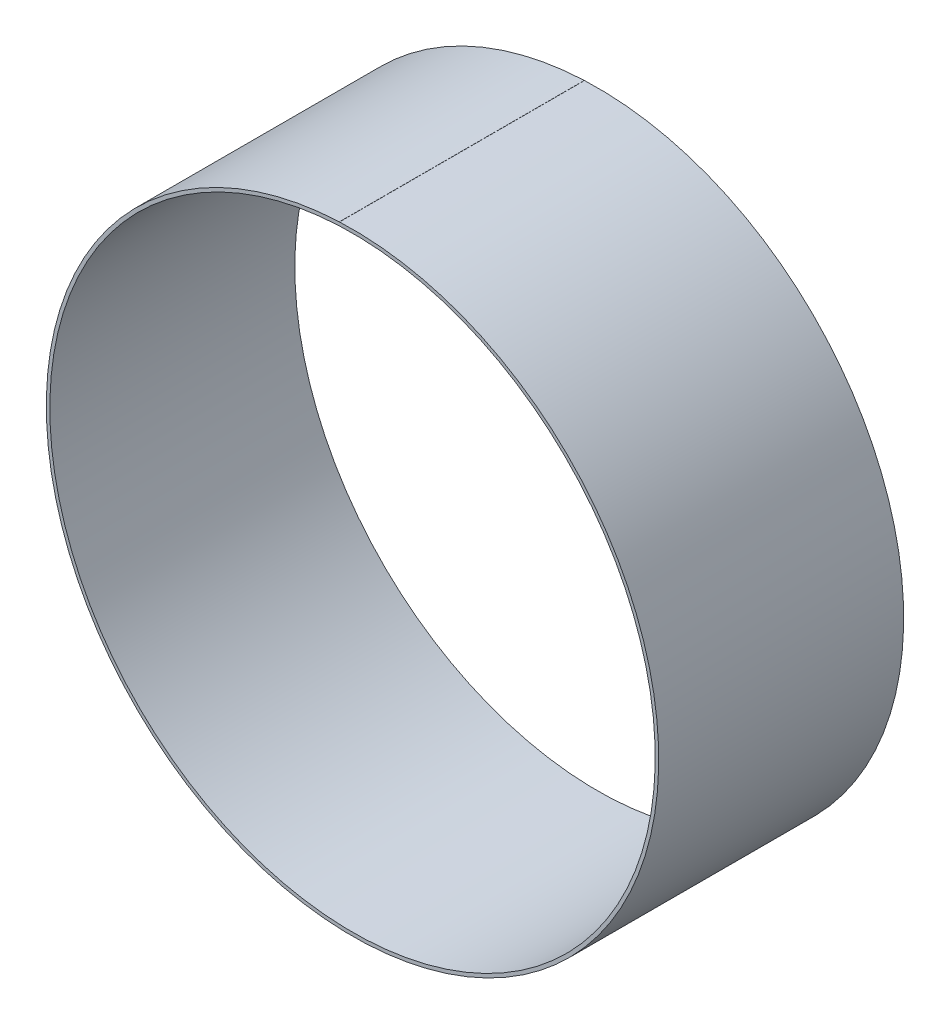
ISO-10303-21;
HEADER;
FILE_DESCRIPTION(('STEP AP214'),'2;1');
FILE_NAME('part.step','',(''),(''),'','','');
FILE_SCHEMA(('AUTOMOTIVE_DESIGN { 1 0 10303 214 1 1 1 1 }'));
ENDSEC;
DATA;
#1=APPLICATION_CONTEXT('core data for automotive mechanical design processes');
#2=APPLICATION_PROTOCOL_DEFINITION('international standard','automotive_design',2000,#1);
#3=PRODUCT_CONTEXT('',#1,'mechanical');
#4=PRODUCT('Part','Part','',(#3));
#5=PRODUCT_RELATED_PRODUCT_CATEGORY('part','',(#4));
#6=PRODUCT_DEFINITION_FORMATION('','',#4);
#7=PRODUCT_DEFINITION_CONTEXT('part definition',#1,'design');
#8=PRODUCT_DEFINITION('design','',#6,#7);
#9=PRODUCT_DEFINITION_SHAPE('','',#8);
#10=(LENGTH_UNIT() NAMED_UNIT(*) SI_UNIT(.MILLI.,.METRE.));
#11=(NAMED_UNIT(*) PLANE_ANGLE_UNIT() SI_UNIT($,.RADIAN.));
#12=(NAMED_UNIT(*) SI_UNIT($,.STERADIAN.) SOLID_ANGLE_UNIT());
#13=UNCERTAINTY_MEASURE_WITH_UNIT(LENGTH_MEASURE(1.E-05),#10,'distance_accuracy_value','');
#14=(GEOMETRIC_REPRESENTATION_CONTEXT(3) GLOBAL_UNCERTAINTY_ASSIGNED_CONTEXT((#13)) GLOBAL_UNIT_ASSIGNED_CONTEXT((#10,
#11,#12)) REPRESENTATION_CONTEXT('',''));
#15=CARTESIAN_POINT('',(0.,0.,0.));
#16=DIRECTION('',(0.,0.,1.));
#17=DIRECTION('',(1.,0.,0.));
#18=AXIS2_PLACEMENT_3D('',#15,#16,#17);
#19=CARTESIAN_POINT('',(0.,0.,10.));
#20=DIRECTION('',(0.,0.,-1.));
#21=DIRECTION('',(-1.,0.,0.));
#22=AXIS2_PLACEMENT_3D('',#19,#20,#21);
#23=CYLINDRICAL_SURFACE('',#22,175.);
#24=DIRECTION('',(0.,0.,-1.));
#25=VECTOR('',#24,1.);
#26=CARTESIAN_POINT('',(-7.53994638221791,174.83749371503,10.));
#27=LINE('',#26,#25);
#28=CARTESIAN_POINT('',(-7.53994638221791,174.83749371503,10.));
#29=VERTEX_POINT('',#28);
#30=CARTESIAN_POINT('',(-7.53994638221791,174.83749371503,-130.));
#31=VERTEX_POINT('',#30);
#32=EDGE_CURVE('E55',#29,#31,#27,.T.);
#33=ORIENTED_EDGE('',*,*,#32,.T.);
#34=CARTESIAN_POINT('',(0.,0.,-130.));
#35=DIRECTION('',(0.,0.,1.));
#36=DIRECTION('',(1.,0.,0.));
#37=AXIS2_PLACEMENT_3D('',#34,#35,#36);
#38=CIRCLE('',#37,175.);
#39=CARTESIAN_POINT('',(-7.43879031285369,174.841826799772,-130.));
#40=VERTEX_POINT('',#39);
#41=EDGE_CURVE('E95',#31,#40,#38,.T.);
#42=ORIENTED_EDGE('',*,*,#41,.T.);
#43=DIRECTION('',(0.,0.,-1.));
#44=VECTOR('',#43,1.);
#45=CARTESIAN_POINT('',(-7.43879031285369,174.841826799772,10.));
#46=LINE('',#45,#44);
#47=CARTESIAN_POINT('',(-7.43879031285369,174.841826799772,10.));
#48=VERTEX_POINT('',#47);
#49=EDGE_CURVE('E11',#48,#40,#46,.T.);
#50=ORIENTED_EDGE('',*,*,#49,.F.);
#51=CARTESIAN_POINT('',(0.,0.,10.));
#52=DIRECTION('',(0.,0.,1.));
#53=DIRECTION('',(1.,0.,0.));
#54=AXIS2_PLACEMENT_3D('',#51,#52,#53);
#55=CIRCLE('',#54,175.);
#56=EDGE_CURVE('E103',#29,#48,#55,.T.);
#57=ORIENTED_EDGE('',*,*,#56,.F.);
#58=EDGE_LOOP('',(#33,#42,#50,#57));
#59=FACE_BOUND('',#58,.T.);
#60=ADVANCED_FACE('F41',(#59),#23,.T.);
#61=CARTESIAN_POINT('',(-7.35377556642107,172.843634493489,10.));
#62=DIRECTION('',(-0.999096153141553,-0.0425073732163063,0.));
#63=DIRECTION('',(0.0425073732163063,-0.999096153141553,0.));
#64=AXIS2_PLACEMENT_3D('',#61,#62,#63);
#65=PLANE('',#64);
#66=ORIENTED_EDGE('',*,*,#49,.T.);
#67=DIRECTION('',(-0.0425073732163063,0.999096153141553,0.));
#68=VECTOR('',#67,1.);
#69=CARTESIAN_POINT('',(-7.35377556642107,172.843634493489,-130.));
#70=LINE('',#69,#68);
#71=CARTESIAN_POINT('',(-7.35377556642107,172.843634493489,-130.));
#72=VERTEX_POINT('',#71);
#73=EDGE_CURVE('E85',#72,#40,#70,.T.);
#74=ORIENTED_EDGE('',*,*,#73,.F.);
#75=DIRECTION('',(0.,0.,-1.));
#76=VECTOR('',#75,1.);
#77=CARTESIAN_POINT('',(-7.35377556642107,172.843634493489,10.));
#78=LINE('',#77,#76);
#79=CARTESIAN_POINT('',(-7.35377556642107,172.843634493489,10.));
#80=VERTEX_POINT('',#79);
#81=EDGE_CURVE('E48',#80,#72,#78,.T.);
#82=ORIENTED_EDGE('',*,*,#81,.F.);
#83=DIRECTION('',(-0.0425073732163063,0.999096153141553,0.));
#84=VECTOR('',#83,1.);
#85=CARTESIAN_POINT('',(-7.35377556642107,172.843634493489,10.));
#86=LINE('',#85,#84);
#87=EDGE_CURVE('E87',#80,#48,#86,.T.);
#88=ORIENTED_EDGE('',*,*,#87,.T.);
#89=EDGE_LOOP('',(#66,#74,#82,#88));
#90=FACE_BOUND('',#89,.T.);
#91=ADVANCED_FACE('F84',(#90),#65,.T.);
#92=CARTESIAN_POINT('',(0.,0.,10.));
#93=DIRECTION('',(0.,0.,-1.));
#94=DIRECTION('',(-1.,0.,0.));
#95=AXIS2_PLACEMENT_3D('',#92,#93,#94);
#96=CYLINDRICAL_SURFACE('',#95,173.);
#97=ORIENTED_EDGE('',*,*,#81,.T.);
#98=CARTESIAN_POINT('',(0.,0.,-130.));
#99=DIRECTION('',(0.,0.,1.));
#100=DIRECTION('',(1.,0.,0.));
#101=AXIS2_PLACEMENT_3D('',#98,#99,#100);
#102=CIRCLE('',#101,173.);
#103=CARTESIAN_POINT('',(-7.45377556642114,172.839350929716,-130.));
#104=VERTEX_POINT('',#103);
#105=EDGE_CURVE('E96',#104,#72,#102,.T.);
#106=ORIENTED_EDGE('',*,*,#105,.F.);
#107=DIRECTION('',(0.,0.,-1.));
#108=VECTOR('',#107,1.);
#109=CARTESIAN_POINT('',(-7.45377556642114,172.839350929716,10.));
#110=LINE('',#109,#108);
#111=CARTESIAN_POINT('',(-7.45377556642114,172.839350929716,10.));
#112=VERTEX_POINT('',#111);
#113=EDGE_CURVE('E63',#112,#104,#110,.T.);
#114=ORIENTED_EDGE('',*,*,#113,.F.);
#115=CARTESIAN_POINT('',(0.,0.,10.));
#116=DIRECTION('',(0.,0.,1.));
#117=DIRECTION('',(1.,0.,0.));
#118=AXIS2_PLACEMENT_3D('',#115,#116,#117);
#119=CIRCLE('',#118,173.);
#120=EDGE_CURVE('E106',#112,#80,#119,.T.);
#121=ORIENTED_EDGE('',*,*,#120,.T.);
#122=EDGE_LOOP('',(#97,#106,#114,#121));
#123=FACE_BOUND('',#122,.T.);
#124=ADVANCED_FACE('F111',(#123),#96,.F.);
#125=CARTESIAN_POINT('',(-7.53994638221791,174.83749371503,10.));
#126=DIRECTION('',(0.999071392657316,0.0430854078983884,0.));
#127=DIRECTION('',(-0.0430854078983884,0.999071392657316,0.));
#128=AXIS2_PLACEMENT_3D('',#125,#126,#127);
#129=PLANE('',#128);
#130=ORIENTED_EDGE('',*,*,#113,.T.);
#131=DIRECTION('',(0.0430854078983884,-0.999071392657316,0.));
#132=VECTOR('',#131,1.);
#133=CARTESIAN_POINT('',(-7.53994638221791,174.83749371503,-130.));
#134=LINE('',#133,#132);
#135=EDGE_CURVE('E101',#31,#104,#134,.T.);
#136=ORIENTED_EDGE('',*,*,#135,.F.);
#137=ORIENTED_EDGE('',*,*,#32,.F.);
#138=DIRECTION('',(0.0430854078983884,-0.999071392657316,0.));
#139=VECTOR('',#138,1.);
#140=CARTESIAN_POINT('',(-7.53994638221791,174.83749371503,10.));
#141=LINE('',#140,#139);
#142=EDGE_CURVE('E108',#29,#112,#141,.T.);
#143=ORIENTED_EDGE('',*,*,#142,.T.);
#144=EDGE_LOOP('',(#130,#136,#137,#143));
#145=FACE_BOUND('',#144,.T.);
#146=ADVANCED_FACE('F115',(#145),#129,.T.);
#147=CARTESIAN_POINT('',(0.,0.,10.));
#148=DIRECTION('',(0.,0.,1.));
#149=DIRECTION('',(1.,0.,0.));
#150=AXIS2_PLACEMENT_3D('',#147,#148,#149);
#151=PLANE('',#150);
#152=ORIENTED_EDGE('',*,*,#56,.T.);
#153=ORIENTED_EDGE('',*,*,#87,.F.);
#154=ORIENTED_EDGE('',*,*,#120,.F.);
#155=ORIENTED_EDGE('',*,*,#142,.F.);
#156=EDGE_LOOP('',(#152,#153,#154,#155));
#157=FACE_BOUND('',#156,.T.);
#158=ADVANCED_FACE('F113',(#157),#151,.T.);
#159=CARTESIAN_POINT('',(0.,0.,-130.));
#160=DIRECTION('',(0.,0.,1.));
#161=DIRECTION('',(1.,0.,0.));
#162=AXIS2_PLACEMENT_3D('',#159,#160,#161);
#163=PLANE('',#162);
#164=ORIENTED_EDGE('',*,*,#41,.F.);
#165=ORIENTED_EDGE('',*,*,#135,.T.);
#166=ORIENTED_EDGE('',*,*,#105,.T.);
#167=ORIENTED_EDGE('',*,*,#73,.T.);
#168=EDGE_LOOP('',(#164,#165,#166,#167));
#169=FACE_BOUND('',#168,.T.);
#170=ADVANCED_FACE('F93',(#169),#163,.F.);
#171=CLOSED_SHELL('',(#60,#91,#124,#146,#158,#170));
#172=MANIFOLD_SOLID_BREP('B2',#171);
#173=ADVANCED_BREP_SHAPE_REPRESENTATION('',(#18,#172),#14);
#174=SHAPE_DEFINITION_REPRESENTATION(#9,#173);
ENDSEC;
END-ISO-10303-21;
